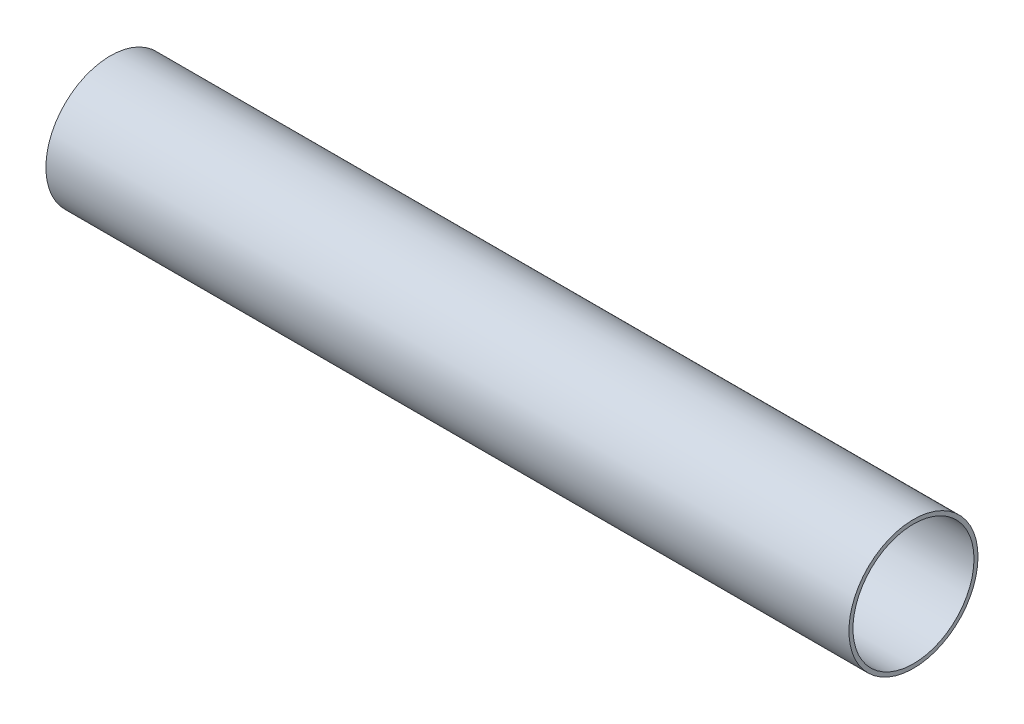
ISO-10303-21;
HEADER;
FILE_DESCRIPTION(('STEP AP214'),'2;1');
FILE_NAME('part.step','',(''),(''),'','','');
FILE_SCHEMA(('AUTOMOTIVE_DESIGN { 1 0 10303 214 1 1 1 1 }'));
ENDSEC;
DATA;
#1=APPLICATION_CONTEXT('core data for automotive mechanical design processes');
#2=APPLICATION_PROTOCOL_DEFINITION('international standard','automotive_design',2000,#1);
#3=PRODUCT_CONTEXT('',#1,'mechanical');
#4=PRODUCT('Part','Part','',(#3));
#5=PRODUCT_RELATED_PRODUCT_CATEGORY('part','',(#4));
#6=PRODUCT_DEFINITION_FORMATION('','',#4);
#7=PRODUCT_DEFINITION_CONTEXT('part definition',#1,'design');
#8=PRODUCT_DEFINITION('design','',#6,#7);
#9=PRODUCT_DEFINITION_SHAPE('','',#8);
#10=(LENGTH_UNIT() NAMED_UNIT(*) SI_UNIT(.MILLI.,.METRE.));
#11=(NAMED_UNIT(*) PLANE_ANGLE_UNIT() SI_UNIT($,.RADIAN.));
#12=(NAMED_UNIT(*) SI_UNIT($,.STERADIAN.) SOLID_ANGLE_UNIT());
#13=UNCERTAINTY_MEASURE_WITH_UNIT(LENGTH_MEASURE(1.E-05),#10,'distance_accuracy_value','');
#14=(GEOMETRIC_REPRESENTATION_CONTEXT(3) GLOBAL_UNCERTAINTY_ASSIGNED_CONTEXT((#13)) GLOBAL_UNIT_ASSIGNED_CONTEXT((#10,
#11,#12)) REPRESENTATION_CONTEXT('',''));
#15=CARTESIAN_POINT('',(0.,0.,0.));
#16=DIRECTION('',(0.,0.,1.));
#17=DIRECTION('',(1.,0.,0.));
#18=AXIS2_PLACEMENT_3D('',#15,#16,#17);
#19=CARTESIAN_POINT('',(88.9,0.,0.));
#20=DIRECTION('',(1.,0.,0.));
#21=DIRECTION('',(0.,0.,-1.));
#22=AXIS2_PLACEMENT_3D('',#19,#20,#21);
#23=PLANE('',#22);
#24=CARTESIAN_POINT('',(88.9,0.,0.));
#25=DIRECTION('',(1.,0.,0.));
#26=DIRECTION('',(0.,0.,-1.));
#27=AXIS2_PLACEMENT_3D('',#24,#25,#26);
#28=CIRCLE('',#27,14.2875);
#29=CARTESIAN_POINT('',(88.9,0.,-14.2875));
#30=VERTEX_POINT('',#29);
#31=EDGE_CURVE('E10',#30,#30,#28,.T.);
#32=ORIENTED_EDGE('',*,*,#31,.T.);
#33=EDGE_LOOP('',(#32));
#34=FACE_BOUND('',#33,.T.);
#35=CARTESIAN_POINT('',(88.9,0.,0.));
#36=DIRECTION('',(1.,0.,0.));
#37=DIRECTION('',(0.,0.,-1.));
#38=AXIS2_PLACEMENT_3D('',#35,#36,#37);
#39=CIRCLE('',#38,13.3985);
#40=CARTESIAN_POINT('',(88.9,0.,-13.3985));
#41=VERTEX_POINT('',#40);
#42=EDGE_CURVE('E42',#41,#41,#39,.T.);
#43=ORIENTED_EDGE('',*,*,#42,.F.);
#44=EDGE_LOOP('',(#43));
#45=FACE_BOUND('',#44,.T.);
#46=ADVANCED_FACE('F31',(#34,#45),#23,.T.);
#47=CARTESIAN_POINT('',(-88.9,0.,0.));
#48=DIRECTION('',(1.,0.,0.));
#49=DIRECTION('',(0.,0.,-1.));
#50=AXIS2_PLACEMENT_3D('',#47,#48,#49);
#51=PLANE('',#50);
#52=CARTESIAN_POINT('',(-88.9,0.,0.));
#53=DIRECTION('',(1.,0.,0.));
#54=DIRECTION('',(0.,0.,-1.));
#55=AXIS2_PLACEMENT_3D('',#52,#53,#54);
#56=CIRCLE('',#55,14.2875);
#57=CARTESIAN_POINT('',(-88.9,0.,-14.2875));
#58=VERTEX_POINT('',#57);
#59=EDGE_CURVE('E35',#58,#58,#56,.T.);
#60=ORIENTED_EDGE('',*,*,#59,.F.);
#61=EDGE_LOOP('',(#60));
#62=FACE_BOUND('',#61,.T.);
#63=CARTESIAN_POINT('',(-88.9,0.,0.));
#64=DIRECTION('',(1.,0.,0.));
#65=DIRECTION('',(0.,0.,-1.));
#66=AXIS2_PLACEMENT_3D('',#63,#64,#65);
#67=CIRCLE('',#66,13.3985);
#68=CARTESIAN_POINT('',(-88.9,0.,-13.3985));
#69=VERTEX_POINT('',#68);
#70=EDGE_CURVE('E44',#69,#69,#67,.T.);
#71=ORIENTED_EDGE('',*,*,#70,.T.);
#72=EDGE_LOOP('',(#71));
#73=FACE_BOUND('',#72,.T.);
#74=ADVANCED_FACE('F54',(#62,#73),#51,.F.);
#75=CARTESIAN_POINT('',(88.9,0.,0.));
#76=DIRECTION('',(-1.,0.,0.));
#77=DIRECTION('',(0.,0.,1.));
#78=AXIS2_PLACEMENT_3D('',#75,#76,#77);
#79=CYLINDRICAL_SURFACE('',#78,14.2875);
#80=ORIENTED_EDGE('',*,*,#31,.F.);
#81=EDGE_LOOP('',(#80));
#82=FACE_BOUND('',#81,.T.);
#83=ORIENTED_EDGE('',*,*,#59,.T.);
#84=EDGE_LOOP('',(#83));
#85=FACE_BOUND('',#84,.T.);
#86=ADVANCED_FACE('F33',(#82,#85),#79,.T.);
#87=CARTESIAN_POINT('',(88.9,0.,0.));
#88=DIRECTION('',(-1.,0.,0.));
#89=DIRECTION('',(0.,0.,1.));
#90=AXIS2_PLACEMENT_3D('',#87,#88,#89);
#91=CYLINDRICAL_SURFACE('',#90,13.3985);
#92=ORIENTED_EDGE('',*,*,#42,.T.);
#93=EDGE_LOOP('',(#92));
#94=FACE_BOUND('',#93,.T.);
#95=ORIENTED_EDGE('',*,*,#70,.F.);
#96=EDGE_LOOP('',(#95));
#97=FACE_BOUND('',#96,.T.);
#98=ADVANCED_FACE('F50',(#94,#97),#91,.F.);
#99=CLOSED_SHELL('',(#46,#74,#86,#98));
#100=MANIFOLD_SOLID_BREP('B2',#99);
#101=ADVANCED_BREP_SHAPE_REPRESENTATION('',(#18,#100),#14);
#102=SHAPE_DEFINITION_REPRESENTATION(#9,#101);
ENDSEC;
END-ISO-10303-21;
